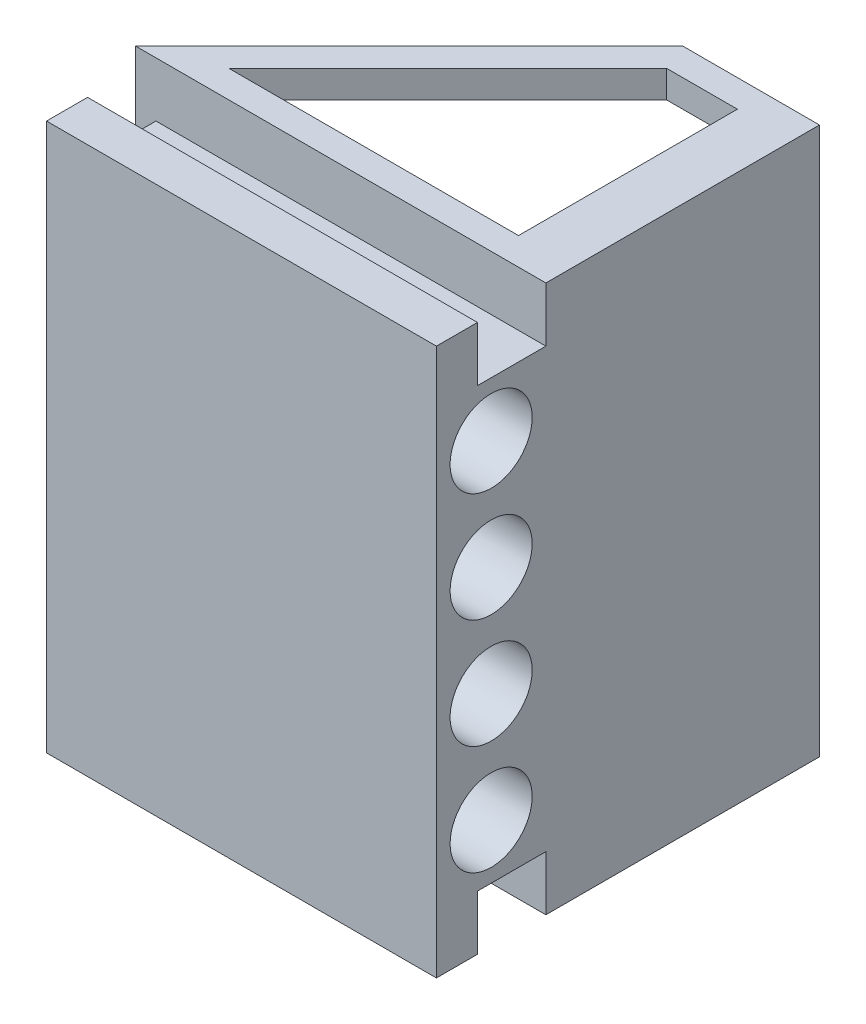
ISO-10303-21;
HEADER;
FILE_DESCRIPTION(('STEP AP214'),'2;1');
FILE_NAME('part.step','',(''),(''),'','','');
FILE_SCHEMA(('AUTOMOTIVE_DESIGN { 1 0 10303 214 1 1 1 1 }'));
ENDSEC;
DATA;
#1=APPLICATION_CONTEXT('core data for automotive mechanical design processes');
#2=APPLICATION_PROTOCOL_DEFINITION('international standard','automotive_design',2000,#1);
#3=PRODUCT_CONTEXT('',#1,'mechanical');
#4=PRODUCT('Part','Part','',(#3));
#5=PRODUCT_RELATED_PRODUCT_CATEGORY('part','',(#4));
#6=PRODUCT_DEFINITION_FORMATION('','',#4);
#7=PRODUCT_DEFINITION_CONTEXT('part definition',#1,'design');
#8=PRODUCT_DEFINITION('design','',#6,#7);
#9=PRODUCT_DEFINITION_SHAPE('','',#8);
#10=(LENGTH_UNIT() NAMED_UNIT(*) SI_UNIT(.MILLI.,.METRE.));
#11=(NAMED_UNIT(*) PLANE_ANGLE_UNIT() SI_UNIT($,.RADIAN.));
#12=(NAMED_UNIT(*) SI_UNIT($,.STERADIAN.) SOLID_ANGLE_UNIT());
#13=UNCERTAINTY_MEASURE_WITH_UNIT(LENGTH_MEASURE(1.E-05),#10,'distance_accuracy_value','');
#14=(GEOMETRIC_REPRESENTATION_CONTEXT(3) GLOBAL_UNCERTAINTY_ASSIGNED_CONTEXT((#13)) GLOBAL_UNIT_ASSIGNED_CONTEXT((#10,
#11,#12)) REPRESENTATION_CONTEXT('',''));
#15=CARTESIAN_POINT('',(0.,0.,0.));
#16=DIRECTION('',(0.,0.,1.));
#17=DIRECTION('',(1.,0.,0.));
#18=AXIS2_PLACEMENT_3D('',#15,#16,#17);
#19=CARTESIAN_POINT('',(-15.6947956584527,-80.,-16.3127275016129));
#20=DIRECTION('',(0.,0.,-1.));
#21=DIRECTION('',(-1.,0.,0.));
#22=AXIS2_PLACEMENT_3D('',#19,#20,#21);
#23=PLANE('',#22);
#24=DIRECTION('',(0.,1.,0.));
#25=VECTOR('',#24,1.);
#26=CARTESIAN_POINT('',(-15.6947956584527,-80.,-16.3127275016129));
#27=LINE('',#26,#25);
#28=CARTESIAN_POINT('',(-15.6947956584527,-4.,-16.3127275016129));
#29=VERTEX_POINT('',#28);
#30=CARTESIAN_POINT('',(-15.6947956584527,0.,-16.3127275016129));
#31=VERTEX_POINT('',#30);
#32=EDGE_CURVE('E278',#29,#31,#27,.T.);
#33=ORIENTED_EDGE('',*,*,#32,.F.);
#34=DIRECTION('',(1.,0.,0.));
#35=VECTOR('',#34,1.);
#36=CARTESIAN_POINT('',(-15.6947956584527,-4.,-16.3127275016129));
#37=LINE('',#36,#35);
#38=CARTESIAN_POINT('',(-5.35164990794508,-4.,-16.3127275016129));
#39=VERTEX_POINT('',#38);
#40=EDGE_CURVE('E196',#29,#39,#37,.T.);
#41=ORIENTED_EDGE('',*,*,#40,.T.);
#42=DIRECTION('',(0.,1.,0.));
#43=VECTOR('',#42,1.);
#44=CARTESIAN_POINT('',(-5.35164990794507,-80.,-16.3127275016129));
#45=LINE('',#44,#43);
#46=CARTESIAN_POINT('',(-5.35164990794507,0.,-16.3127275016129));
#47=VERTEX_POINT('',#46);
#48=EDGE_CURVE('E293',#39,#47,#45,.T.);
#49=ORIENTED_EDGE('',*,*,#48,.T.);
#50=DIRECTION('',(-1.,0.,0.));
#51=VECTOR('',#50,1.);
#52=CARTESIAN_POINT('',(-15.6947956584527,0.,-16.3127275016129));
#53=LINE('',#52,#51);
#54=EDGE_CURVE('E264',#47,#31,#53,.T.);
#55=ORIENTED_EDGE('',*,*,#54,.T.);
#56=EDGE_LOOP('',(#33,#41,#49,#55));
#57=FACE_BOUND('',#56,.T.);
#58=ADVANCED_FACE('F37',(#57),#23,.F.);
#59=CARTESIAN_POINT('',(-47.6947956584527,-80.,15.6872724983871));
#60=DIRECTION('',(-0.707106781186548,0.,-0.707106781186547));
#61=DIRECTION('',(-0.707106781186547,0.,0.707106781186548));
#62=AXIS2_PLACEMENT_3D('',#59,#60,#61);
#63=PLANE('',#62);
#64=DIRECTION('',(0.,1.,0.));
#65=VECTOR('',#64,1.);
#66=CARTESIAN_POINT('',(-47.6947956584527,-80.,15.6872724983871));
#67=LINE('',#66,#65);
#68=CARTESIAN_POINT('',(-47.6947956584527,-4.,15.6872724983871));
#69=VERTEX_POINT('',#68);
#70=CARTESIAN_POINT('',(-47.6947956584527,0.,15.6872724983871));
#71=VERTEX_POINT('',#70);
#72=EDGE_CURVE('E297',#69,#71,#67,.T.);
#73=ORIENTED_EDGE('',*,*,#72,.F.);
#74=DIRECTION('',(0.707106781186547,0.,-0.707106781186548));
#75=VECTOR('',#74,1.);
#76=CARTESIAN_POINT('',(-47.6947956584527,-4.,15.6872724983871));
#77=LINE('',#76,#75);
#78=EDGE_CURVE('E11',#69,#29,#77,.T.);
#79=ORIENTED_EDGE('',*,*,#78,.T.);
#80=ORIENTED_EDGE('',*,*,#32,.T.);
#81=DIRECTION('',(-0.707106781186547,0.,0.707106781186548));
#82=VECTOR('',#81,1.);
#83=CARTESIAN_POINT('',(-47.6947956584527,0.,15.6872724983871));
#84=LINE('',#83,#82);
#85=EDGE_CURVE('E281',#31,#71,#84,.T.);
#86=ORIENTED_EDGE('',*,*,#85,.T.);
#87=EDGE_LOOP('',(#73,#79,#80,#86));
#88=FACE_BOUND('',#87,.T.);
#89=ADVANCED_FACE('F412',(#88),#63,.F.);
#90=CARTESIAN_POINT('',(-54.3516499079451,-7.99999999999999,19.687272498387));
#91=DIRECTION('',(0.,1.,0.));
#92=DIRECTION('',(0.,0.,1.));
#93=AXIS2_PLACEMENT_3D('',#90,#91,#92);
#94=PLANE('',#93);
#95=DIRECTION('',(0.,0.,1.));
#96=VECTOR('',#95,1.);
#97=CARTESIAN_POINT('',(-54.3516499079451,-7.99999999999999,19.687272498387));
#98=LINE('',#97,#96);
#99=CARTESIAN_POINT('',(-54.3516499079451,-7.99999999999999,19.687272498387));
#100=VERTEX_POINT('',#99);
#101=CARTESIAN_POINT('',(-54.3516499079451,-7.99999999999999,29.6872724983871));
#102=VERTEX_POINT('',#101);
#103=EDGE_CURVE('E328',#100,#102,#98,.T.);
#104=ORIENTED_EDGE('',*,*,#103,.T.);
#105=DIRECTION('',(-1.,0.,0.));
#106=VECTOR('',#105,1.);
#107=CARTESIAN_POINT('',(-54.3516499079451,-7.99999999999999,29.6872724983871));
#108=LINE('',#107,#106);
#109=CARTESIAN_POINT('',(2.64835009205493,-7.99999999999999,29.6872724983871));
#110=VERTEX_POINT('',#109);
#111=EDGE_CURVE('E225',#110,#102,#108,.T.);
#112=ORIENTED_EDGE('',*,*,#111,.F.);
#113=DIRECTION('',(0.,0.,1.));
#114=VECTOR('',#113,1.);
#115=CARTESIAN_POINT('',(2.64835009205493,-7.99999999999999,19.687272498387));
#116=LINE('',#115,#114);
#117=CARTESIAN_POINT('',(2.64835009205493,-7.99999999999999,19.687272498387));
#118=VERTEX_POINT('',#117);
#119=EDGE_CURVE('E304',#118,#110,#116,.T.);
#120=ORIENTED_EDGE('',*,*,#119,.F.);
#121=DIRECTION('',(1.,0.,0.));
#122=VECTOR('',#121,1.);
#123=CARTESIAN_POINT('',(-54.3516499079451,-7.99999999999999,19.687272498387));
#124=LINE('',#123,#122);
#125=EDGE_CURVE('E335',#100,#118,#124,.T.);
#126=ORIENTED_EDGE('',*,*,#125,.F.);
#127=EDGE_LOOP('',(#104,#112,#120,#126));
#128=FACE_BOUND('',#127,.T.);
#129=ADVANCED_FACE('F425',(#128),#94,.T.);
#130=CARTESIAN_POINT('',(-54.3516499079451,-72.,19.687272498387));
#131=DIRECTION('',(0.,-1.,0.));
#132=DIRECTION('',(0.,0.,-1.));
#133=AXIS2_PLACEMENT_3D('',#130,#131,#132);
#134=PLANE('',#133);
#135=DIRECTION('',(0.,0.,-1.));
#136=VECTOR('',#135,1.);
#137=CARTESIAN_POINT('',(2.64835009205493,-72.,19.687272498387));
#138=LINE('',#137,#136);
#139=CARTESIAN_POINT('',(2.64835009205493,-72.,29.687272498387));
#140=VERTEX_POINT('',#139);
#141=CARTESIAN_POINT('',(2.64835009205493,-72.,19.687272498387));
#142=VERTEX_POINT('',#141);
#143=EDGE_CURVE('E329',#140,#142,#138,.T.);
#144=ORIENTED_EDGE('',*,*,#143,.F.);
#145=DIRECTION('',(1.,0.,0.));
#146=VECTOR('',#145,1.);
#147=CARTESIAN_POINT('',(-54.3516499079451,-72.,29.687272498387));
#148=LINE('',#147,#146);
#149=CARTESIAN_POINT('',(-54.3516499079451,-72.,29.687272498387));
#150=VERTEX_POINT('',#149);
#151=EDGE_CURVE('E244',#150,#140,#148,.T.);
#152=ORIENTED_EDGE('',*,*,#151,.F.);
#153=DIRECTION('',(0.,0.,-1.));
#154=VECTOR('',#153,1.);
#155=CARTESIAN_POINT('',(-54.3516499079451,-72.,19.687272498387));
#156=LINE('',#155,#154);
#157=CARTESIAN_POINT('',(-54.3516499079451,-72.,19.687272498387));
#158=VERTEX_POINT('',#157);
#159=EDGE_CURVE('E333',#150,#158,#156,.T.);
#160=ORIENTED_EDGE('',*,*,#159,.T.);
#161=DIRECTION('',(1.,0.,0.));
#162=VECTOR('',#161,1.);
#163=CARTESIAN_POINT('',(-54.3516499079451,-72.,19.687272498387));
#164=LINE('',#163,#162);
#165=EDGE_CURVE('E341',#158,#142,#164,.T.);
#166=ORIENTED_EDGE('',*,*,#165,.T.);
#167=EDGE_LOOP('',(#144,#152,#160,#166));
#168=FACE_BOUND('',#167,.T.);
#169=ADVANCED_FACE('F472',(#168),#134,.T.);
#170=CARTESIAN_POINT('',(-18.832188704779,-80.,-18.832188704779));
#171=DIRECTION('',(-0.707106781186548,0.,-0.707106781186548));
#172=DIRECTION('',(-0.707106781186548,0.,0.707106781186548));
#173=AXIS2_PLACEMENT_3D('',#170,#171,#172);
#174=PLANE('',#173);
#175=DIRECTION('',(0.707106781186548,0.,-0.707106781186548));
#176=VECTOR('',#175,1.);
#177=CARTESIAN_POINT('',(-18.832188704779,-4.,-18.832188704779));
#178=LINE('',#177,#176);
#179=CARTESIAN_POINT('',(-53.3516499079451,-4.,15.687272498387));
#180=VERTEX_POINT('',#179);
#181=CARTESIAN_POINT('',(-17.3516499079451,-4.,-20.312727501613));
#182=VERTEX_POINT('',#181);
#183=EDGE_CURVE('E208',#180,#182,#178,.T.);
#184=ORIENTED_EDGE('',*,*,#183,.F.);
#185=DIRECTION('',(0.,1.,0.));
#186=VECTOR('',#185,1.);
#187=CARTESIAN_POINT('',(-53.3516499079451,-4.,15.687272498387));
#188=LINE('',#187,#186);
#189=CARTESIAN_POINT('',(-53.3516499079451,-76.,15.687272498387));
#190=VERTEX_POINT('',#189);
#191=EDGE_CURVE('E201',#190,#180,#188,.T.);
#192=ORIENTED_EDGE('',*,*,#191,.F.);
#193=DIRECTION('',(-0.707106781186548,0.,0.707106781186548));
#194=VECTOR('',#193,1.);
#195=CARTESIAN_POINT('',(-18.832188704779,-76.,-18.832188704779));
#196=LINE('',#195,#194);
#197=CARTESIAN_POINT('',(-17.3516499079451,-76.,-20.312727501613));
#198=VERTEX_POINT('',#197);
#199=EDGE_CURVE('E186',#198,#190,#196,.T.);
#200=ORIENTED_EDGE('',*,*,#199,.F.);
#201=DIRECTION('',(0.,1.,0.));
#202=VECTOR('',#201,1.);
#203=CARTESIAN_POINT('',(-17.3516499079451,-80.,-20.3127275016129));
#204=LINE('',#203,#202);
#205=CARTESIAN_POINT('',(-17.3516499079451,-80.,-20.3127275016129));
#206=VERTEX_POINT('',#205);
#207=EDGE_CURVE('E368',#206,#198,#204,.T.);
#208=ORIENTED_EDGE('',*,*,#207,.F.);
#209=DIRECTION('',(-0.707106781186548,0.,0.707106781186548));
#210=VECTOR('',#209,1.);
#211=CARTESIAN_POINT('',(-18.832188704779,-80.,-18.832188704779));
#212=LINE('',#211,#210);
#213=CARTESIAN_POINT('',(-57.3516499079451,-80.,19.687272498387));
#214=VERTEX_POINT('',#213);
#215=EDGE_CURVE('E347',#206,#214,#212,.T.);
#216=ORIENTED_EDGE('',*,*,#215,.T.);
#217=DIRECTION('',(0.,1.,0.));
#218=VECTOR('',#217,1.);
#219=CARTESIAN_POINT('',(-57.3516499079451,-80.,19.687272498387));
#220=LINE('',#219,#218);
#221=CARTESIAN_POINT('',(-57.3516499079451,0.,19.687272498387));
#222=VERTEX_POINT('',#221);
#223=EDGE_CURVE('E358',#214,#222,#220,.T.);
#224=ORIENTED_EDGE('',*,*,#223,.T.);
#225=DIRECTION('',(-0.707106781186548,0.,0.707106781186548));
#226=VECTOR('',#225,1.);
#227=CARTESIAN_POINT('',(-18.832188704779,0.,-18.832188704779));
#228=LINE('',#227,#226);
#229=CARTESIAN_POINT('',(-17.3516499079451,0.,-20.3127275016129));
#230=VERTEX_POINT('',#229);
#231=EDGE_CURVE('E344',#230,#222,#228,.T.);
#232=ORIENTED_EDGE('',*,*,#231,.F.);
#233=EDGE_CURVE('E370',#182,#230,#204,.T.);
#234=ORIENTED_EDGE('',*,*,#233,.F.);
#235=EDGE_LOOP('',(#184,#192,#200,#208,#216,#224,#232,#234));
#236=FACE_BOUND('',#235,.T.);
#237=ADVANCED_FACE('F39',(#236),#174,.T.);
#238=CARTESIAN_POINT('',(0.,-80.,-20.312727501613));
#239=DIRECTION('',(0.,0.,1.));
#240=DIRECTION('',(1.,0.,0.));
#241=AXIS2_PLACEMENT_3D('',#238,#239,#240);
#242=PLANE('',#241);
#243=DIRECTION('',(0.,-1.,0.));
#244=VECTOR('',#243,1.);
#245=CARTESIAN_POINT('',(-5.35164990794508,-4.,-20.312727501613));
#246=LINE('',#245,#244);
#247=CARTESIAN_POINT('',(-5.35164990794508,-4.,-20.312727501613));
#248=VERTEX_POINT('',#247);
#249=CARTESIAN_POINT('',(-5.35164990794509,-76.,-20.312727501613));
#250=VERTEX_POINT('',#249);
#251=EDGE_CURVE('E52',#248,#250,#246,.T.);
#252=ORIENTED_EDGE('',*,*,#251,.F.);
#253=DIRECTION('',(1.,0.,0.));
#254=VECTOR('',#253,1.);
#255=CARTESIAN_POINT('',(-5.35164990794508,-4.,-20.312727501613));
#256=LINE('',#255,#254);
#257=EDGE_CURVE('E204',#182,#248,#256,.T.);
#258=ORIENTED_EDGE('',*,*,#257,.F.);
#259=ORIENTED_EDGE('',*,*,#233,.T.);
#260=DIRECTION('',(1.,0.,0.));
#261=VECTOR('',#260,1.);
#262=CARTESIAN_POINT('',(0.,0.,-20.312727501613));
#263=LINE('',#262,#261);
#264=CARTESIAN_POINT('',(2.64835009205492,0.,-20.312727501613));
#265=VERTEX_POINT('',#264);
#266=EDGE_CURVE('E351',#230,#265,#263,.T.);
#267=ORIENTED_EDGE('',*,*,#266,.T.);
#268=DIRECTION('',(0.,1.,0.));
#269=VECTOR('',#268,1.);
#270=CARTESIAN_POINT('',(2.64835009205492,-80.,-20.312727501613));
#271=LINE('',#270,#269);
#272=CARTESIAN_POINT('',(2.64835009205492,-80.,-20.312727501613));
#273=VERTEX_POINT('',#272);
#274=EDGE_CURVE('E371',#273,#265,#271,.T.);
#275=ORIENTED_EDGE('',*,*,#274,.F.);
#276=DIRECTION('',(1.,0.,0.));
#277=VECTOR('',#276,1.);
#278=CARTESIAN_POINT('',(0.,-80.,-20.312727501613));
#279=LINE('',#278,#277);
#280=EDGE_CURVE('E356',#206,#273,#279,.T.);
#281=ORIENTED_EDGE('',*,*,#280,.F.);
#282=ORIENTED_EDGE('',*,*,#207,.T.);
#283=DIRECTION('',(-1.,0.,0.));
#284=VECTOR('',#283,1.);
#285=CARTESIAN_POINT('',(-5.35164990794509,-76.,-20.312727501613));
#286=LINE('',#285,#284);
#287=EDGE_CURVE('E192',#250,#198,#286,.T.);
#288=ORIENTED_EDGE('',*,*,#287,.F.);
#289=EDGE_LOOP('',(#252,#258,#259,#267,#275,#281,#282,#288));
#290=FACE_BOUND('',#289,.T.);
#291=ADVANCED_FACE('F387',(#290),#242,.F.);
#292=CARTESIAN_POINT('',(2.64835009205493,-80.,0.));
#293=DIRECTION('',(-1.,0.,0.));
#294=DIRECTION('',(0.,0.,1.));
#295=AXIS2_PLACEMENT_3D('',#292,#293,#294);
#296=PLANE('',#295);
#297=CARTESIAN_POINT('',(2.64835009205493,-16.,27.6872724983871));
#298=DIRECTION('',(1.,0.,0.));
#299=DIRECTION('',(0.,0.,-1.));
#300=AXIS2_PLACEMENT_3D('',#297,#298,#299);
#301=CIRCLE('',#300,6.);
#302=CARTESIAN_POINT('',(2.64835009205493,-16.,21.6872724983871));
#303=VERTEX_POINT('',#302);
#304=EDGE_CURVE('E305',#303,#303,#301,.T.);
#305=ORIENTED_EDGE('',*,*,#304,.F.);
#306=EDGE_LOOP('',(#305));
#307=FACE_BOUND('',#306,.T.);
#308=CARTESIAN_POINT('',(2.64835009205493,-48.,27.6872724983871));
#309=DIRECTION('',(1.,0.,0.));
#310=DIRECTION('',(0.,0.,-1.));
#311=AXIS2_PLACEMENT_3D('',#308,#309,#310);
#312=CIRCLE('',#311,6.);
#313=CARTESIAN_POINT('',(2.64835009205493,-48.,21.6872724983871));
#314=VERTEX_POINT('',#313);
#315=EDGE_CURVE('E292',#314,#314,#312,.T.);
#316=ORIENTED_EDGE('',*,*,#315,.F.);
#317=EDGE_LOOP('',(#316));
#318=FACE_BOUND('',#317,.T.);
#319=CARTESIAN_POINT('',(2.64835009205493,-64.,27.6872724983871));
#320=DIRECTION('',(1.,0.,0.));
#321=DIRECTION('',(0.,0.,1.));
#322=AXIS2_PLACEMENT_3D('',#319,#320,#321);
#323=CIRCLE('',#322,6.);
#324=CARTESIAN_POINT('',(2.64835009205493,-64.,33.6872724983871));
#325=VERTEX_POINT('',#324);
#326=EDGE_CURVE('E312',#325,#325,#323,.T.);
#327=ORIENTED_EDGE('',*,*,#326,.F.);
#328=EDGE_LOOP('',(#327));
#329=FACE_BOUND('',#328,.T.);
#330=CARTESIAN_POINT('',(2.64835009205493,-32.,27.6872724983871));
#331=DIRECTION('',(1.,0.,0.));
#332=DIRECTION('',(0.,0.,1.));
#333=AXIS2_PLACEMENT_3D('',#330,#331,#332);
#334=CIRCLE('',#333,6.);
#335=CARTESIAN_POINT('',(2.64835009205493,-32.,33.6872724983871));
#336=VERTEX_POINT('',#335);
#337=EDGE_CURVE('E317',#336,#336,#334,.T.);
#338=ORIENTED_EDGE('',*,*,#337,.F.);
#339=EDGE_LOOP('',(#338));
#340=FACE_BOUND('',#339,.T.);
#341=DIRECTION('',(0.,0.,1.));
#342=VECTOR('',#341,1.);
#343=CARTESIAN_POINT('',(2.64835009205493,0.,0.));
#344=LINE('',#343,#342);
#345=CARTESIAN_POINT('',(2.64835009205493,0.,19.687272498387));
#346=VERTEX_POINT('',#345);
#347=EDGE_CURVE('E364',#265,#346,#344,.T.);
#348=ORIENTED_EDGE('',*,*,#347,.T.);
#349=DIRECTION('',(0.,1.,0.));
#350=VECTOR('',#349,1.);
#351=CARTESIAN_POINT('',(2.64835009205493,-80.,19.687272498387));
#352=LINE('',#351,#350);
#353=EDGE_CURVE('E377',#118,#346,#352,.T.);
#354=ORIENTED_EDGE('',*,*,#353,.F.);
#355=ORIENTED_EDGE('',*,*,#119,.T.);
#356=DIRECTION('',(0.,-1.,0.));
#357=VECTOR('',#356,1.);
#358=CARTESIAN_POINT('',(2.64835009205493,0.,29.6872724983871));
#359=LINE('',#358,#357);
#360=CARTESIAN_POINT('',(2.64835009205493,0.,29.6872724983871));
#361=VERTEX_POINT('',#360);
#362=EDGE_CURVE('E241',#361,#110,#359,.T.);
#363=ORIENTED_EDGE('',*,*,#362,.F.);
#364=DIRECTION('',(0.,0.,-1.));
#365=VECTOR('',#364,1.);
#366=CARTESIAN_POINT('',(2.64835009205493,0.,35.6872724983871));
#367=LINE('',#366,#365);
#368=CARTESIAN_POINT('',(2.64835009205493,0.,35.6872724983871));
#369=VERTEX_POINT('',#368);
#370=EDGE_CURVE('E232',#369,#361,#367,.T.);
#371=ORIENTED_EDGE('',*,*,#370,.F.);
#372=DIRECTION('',(0.,-1.,0.));
#373=VECTOR('',#372,1.);
#374=CARTESIAN_POINT('',(2.64835009205493,-7.99999999999999,35.6872724983871));
#375=LINE('',#374,#373);
#376=CARTESIAN_POINT('',(2.64835009205493,-80.,35.687272498387));
#377=VERTEX_POINT('',#376);
#378=EDGE_CURVE('E338',#369,#377,#375,.T.);
#379=ORIENTED_EDGE('',*,*,#378,.T.);
#380=DIRECTION('',(0.,0.,1.));
#381=VECTOR('',#380,1.);
#382=CARTESIAN_POINT('',(2.64835009205493,-80.,35.687272498387));
#383=LINE('',#382,#381);
#384=CARTESIAN_POINT('',(2.64835009205493,-80.,29.687272498387));
#385=VERTEX_POINT('',#384);
#386=EDGE_CURVE('E250',#385,#377,#383,.T.);
#387=ORIENTED_EDGE('',*,*,#386,.F.);
#388=DIRECTION('',(0.,1.,0.));
#389=VECTOR('',#388,1.);
#390=CARTESIAN_POINT('',(2.64835009205493,-80.,29.687272498387));
#391=LINE('',#390,#389);
#392=EDGE_CURVE('E256',#385,#140,#391,.T.);
#393=ORIENTED_EDGE('',*,*,#392,.T.);
#394=ORIENTED_EDGE('',*,*,#143,.T.);
#395=CARTESIAN_POINT('',(2.64835009205493,-80.,19.687272498387));
#396=VERTEX_POINT('',#395);
#397=EDGE_CURVE('E374',#396,#142,#352,.T.);
#398=ORIENTED_EDGE('',*,*,#397,.F.);
#399=DIRECTION('',(0.,0.,1.));
#400=VECTOR('',#399,1.);
#401=CARTESIAN_POINT('',(2.64835009205493,-80.,0.));
#402=LINE('',#401,#400);
#403=EDGE_CURVE('E354',#273,#396,#402,.T.);
#404=ORIENTED_EDGE('',*,*,#403,.F.);
#405=ORIENTED_EDGE('',*,*,#274,.T.);
#406=EDGE_LOOP('',(#348,#354,#355,#363,#371,#379,#387,#393,#394,#398,#404,#405));
#407=FACE_BOUND('',#406,.T.);
#408=ADVANCED_FACE('F489',(#307,#318,#329,#340,#407),#296,.F.);
#409=CARTESIAN_POINT('',(0.,-80.,19.687272498387));
#410=DIRECTION('',(0.,0.,1.));
#411=DIRECTION('',(1.,0.,0.));
#412=AXIS2_PLACEMENT_3D('',#409,#410,#411);
#413=PLANE('',#412);
#414=ORIENTED_EDGE('',*,*,#165,.F.);
#415=DIRECTION('',(0.,1.,0.));
#416=VECTOR('',#415,1.);
#417=CARTESIAN_POINT('',(-54.3516499079451,-7.99999999999999,19.687272498387));
#418=LINE('',#417,#416);
#419=EDGE_CURVE('E325',#158,#100,#418,.T.);
#420=ORIENTED_EDGE('',*,*,#419,.T.);
#421=ORIENTED_EDGE('',*,*,#125,.T.);
#422=ORIENTED_EDGE('',*,*,#353,.T.);
#423=DIRECTION('',(1.,0.,0.));
#424=VECTOR('',#423,1.);
#425=CARTESIAN_POINT('',(0.,0.,19.687272498387));
#426=LINE('',#425,#424);
#427=EDGE_CURVE('E361',#222,#346,#426,.T.);
#428=ORIENTED_EDGE('',*,*,#427,.F.);
#429=ORIENTED_EDGE('',*,*,#223,.F.);
#430=DIRECTION('',(1.,0.,0.));
#431=VECTOR('',#430,1.);
#432=CARTESIAN_POINT('',(0.,-80.,19.687272498387));
#433=LINE('',#432,#431);
#434=EDGE_CURVE('E350',#214,#396,#433,.T.);
#435=ORIENTED_EDGE('',*,*,#434,.T.);
#436=ORIENTED_EDGE('',*,*,#397,.T.);
#437=EDGE_LOOP('',(#414,#420,#421,#422,#428,#429,#435,#436));
#438=FACE_BOUND('',#437,.T.);
#439=ADVANCED_FACE('F401',(#438),#413,.T.);
#440=CARTESIAN_POINT('',(0.,-80.,0.));
#441=DIRECTION('',(0.,1.,0.));
#442=DIRECTION('',(0.,0.,1.));
#443=AXIS2_PLACEMENT_3D('',#440,#441,#442);
#444=PLANE('',#443);
#445=DIRECTION('',(0.,0.,-1.));
#446=VECTOR('',#445,1.);
#447=CARTESIAN_POINT('',(-5.35164990794507,-80.,-16.3127275016129));
#448=LINE('',#447,#446);
#449=CARTESIAN_POINT('',(-5.35164990794507,-80.,15.687272498387));
#450=VERTEX_POINT('',#449);
#451=CARTESIAN_POINT('',(-5.35164990794507,-80.,-16.3127275016129));
#452=VERTEX_POINT('',#451);
#453=EDGE_CURVE('E275',#450,#452,#448,.T.);
#454=ORIENTED_EDGE('',*,*,#453,.T.);
#455=DIRECTION('',(-1.,0.,0.));
#456=VECTOR('',#455,1.);
#457=CARTESIAN_POINT('',(-15.6947956584527,-80.,-16.3127275016129));
#458=LINE('',#457,#456);
#459=CARTESIAN_POINT('',(-15.6947956584527,-80.,-16.3127275016129));
#460=VERTEX_POINT('',#459);
#461=EDGE_CURVE('E265',#452,#460,#458,.T.);
#462=ORIENTED_EDGE('',*,*,#461,.T.);
#463=DIRECTION('',(-0.707106781186547,0.,0.707106781186548));
#464=VECTOR('',#463,1.);
#465=CARTESIAN_POINT('',(-47.6947956584527,-80.,15.6872724983871));
#466=LINE('',#465,#464);
#467=CARTESIAN_POINT('',(-47.6947956584527,-80.,15.6872724983871));
#468=VERTEX_POINT('',#467);
#469=EDGE_CURVE('E268',#460,#468,#466,.T.);
#470=ORIENTED_EDGE('',*,*,#469,.T.);
#471=DIRECTION('',(1.,0.,0.));
#472=VECTOR('',#471,1.);
#473=CARTESIAN_POINT('',(-5.35164990794507,-80.,15.687272498387));
#474=LINE('',#473,#472);
#475=EDGE_CURVE('E272',#468,#450,#474,.T.);
#476=ORIENTED_EDGE('',*,*,#475,.T.);
#477=EDGE_LOOP('',(#454,#462,#470,#476));
#478=FACE_BOUND('',#477,.T.);
#479=ORIENTED_EDGE('',*,*,#215,.F.);
#480=ORIENTED_EDGE('',*,*,#280,.T.);
#481=ORIENTED_EDGE('',*,*,#403,.T.);
#482=ORIENTED_EDGE('',*,*,#434,.F.);
#483=EDGE_LOOP('',(#479,#480,#481,#482));
#484=FACE_BOUND('',#483,.T.);
#485=ADVANCED_FACE('F396',(#478,#484),#444,.F.);
#486=CARTESIAN_POINT('',(0.,0.,0.));
#487=DIRECTION('',(0.,1.,0.));
#488=DIRECTION('',(0.,0.,1.));
#489=AXIS2_PLACEMENT_3D('',#486,#487,#488);
#490=PLANE('',#489);
#491=ORIENTED_EDGE('',*,*,#54,.F.);
#492=DIRECTION('',(0.,0.,-1.));
#493=VECTOR('',#492,1.);
#494=CARTESIAN_POINT('',(-5.35164990794507,0.,-16.3127275016129));
#495=LINE('',#494,#493);
#496=CARTESIAN_POINT('',(-5.35164990794507,0.,15.687272498387));
#497=VERTEX_POINT('',#496);
#498=EDGE_CURVE('E269',#497,#47,#495,.T.);
#499=ORIENTED_EDGE('',*,*,#498,.F.);
#500=DIRECTION('',(1.,0.,0.));
#501=VECTOR('',#500,1.);
#502=CARTESIAN_POINT('',(-5.35164990794507,0.,15.687272498387));
#503=LINE('',#502,#501);
#504=EDGE_CURVE('E284',#71,#497,#503,.T.);
#505=ORIENTED_EDGE('',*,*,#504,.F.);
#506=ORIENTED_EDGE('',*,*,#85,.F.);
#507=EDGE_LOOP('',(#491,#499,#505,#506));
#508=FACE_BOUND('',#507,.T.);
#509=ORIENTED_EDGE('',*,*,#231,.T.);
#510=ORIENTED_EDGE('',*,*,#427,.T.);
#511=ORIENTED_EDGE('',*,*,#347,.F.);
#512=ORIENTED_EDGE('',*,*,#266,.F.);
#513=EDGE_LOOP('',(#509,#510,#511,#512));
#514=FACE_BOUND('',#513,.T.);
#515=ADVANCED_FACE('F406',(#508,#514),#490,.T.);
#516=CARTESIAN_POINT('',(-54.3516499079451,-7.99999999999999,35.6872724983871));
#517=DIRECTION('',(0.,0.,1.));
#518=DIRECTION('',(0.,-1.,0.));
#519=AXIS2_PLACEMENT_3D('',#516,#517,#518);
#520=PLANE('',#519);
#521=ORIENTED_EDGE('',*,*,#378,.F.);
#522=DIRECTION('',(1.,0.,0.));
#523=VECTOR('',#522,1.);
#524=CARTESIAN_POINT('',(-54.3516499079451,0.,35.6872724983871));
#525=LINE('',#524,#523);
#526=CARTESIAN_POINT('',(-54.3516499079451,0.,35.6872724983871));
#527=VERTEX_POINT('',#526);
#528=EDGE_CURVE('E229',#527,#369,#525,.T.);
#529=ORIENTED_EDGE('',*,*,#528,.F.);
#530=DIRECTION('',(0.,-1.,0.));
#531=VECTOR('',#530,1.);
#532=CARTESIAN_POINT('',(-54.3516499079451,-7.99999999999999,35.6872724983871));
#533=LINE('',#532,#531);
#534=CARTESIAN_POINT('',(-54.3516499079451,-80.,35.687272498387));
#535=VERTEX_POINT('',#534);
#536=EDGE_CURVE('E331',#527,#535,#533,.T.);
#537=ORIENTED_EDGE('',*,*,#536,.T.);
#538=DIRECTION('',(-1.,0.,0.));
#539=VECTOR('',#538,1.);
#540=CARTESIAN_POINT('',(-54.3516499079451,-80.,35.687272498387));
#541=LINE('',#540,#539);
#542=EDGE_CURVE('E253',#377,#535,#541,.T.);
#543=ORIENTED_EDGE('',*,*,#542,.F.);
#544=EDGE_LOOP('',(#521,#529,#537,#543));
#545=FACE_BOUND('',#544,.T.);
#546=ADVANCED_FACE('F470',(#545),#520,.T.);
#547=CARTESIAN_POINT('',(-54.3516499079451,0.,0.));
#548=DIRECTION('',(-1.,0.,0.));
#549=DIRECTION('',(0.,0.,1.));
#550=AXIS2_PLACEMENT_3D('',#547,#548,#549);
#551=PLANE('',#550);
#552=ORIENTED_EDGE('',*,*,#419,.F.);
#553=ORIENTED_EDGE('',*,*,#159,.F.);
#554=DIRECTION('',(0.,1.,0.));
#555=VECTOR('',#554,1.);
#556=CARTESIAN_POINT('',(-54.3516499079451,-80.,29.687272498387));
#557=LINE('',#556,#555);
#558=CARTESIAN_POINT('',(-54.3516499079451,-80.,29.687272498387));
#559=VERTEX_POINT('',#558);
#560=EDGE_CURVE('E261',#559,#150,#557,.T.);
#561=ORIENTED_EDGE('',*,*,#560,.F.);
#562=DIRECTION('',(0.,0.,-1.));
#563=VECTOR('',#562,1.);
#564=CARTESIAN_POINT('',(-54.3516499079451,-80.,35.687272498387));
#565=LINE('',#564,#563);
#566=EDGE_CURVE('E245',#535,#559,#565,.T.);
#567=ORIENTED_EDGE('',*,*,#566,.F.);
#568=ORIENTED_EDGE('',*,*,#536,.F.);
#569=DIRECTION('',(0.,0.,1.));
#570=VECTOR('',#569,1.);
#571=CARTESIAN_POINT('',(-54.3516499079451,0.,35.6872724983871));
#572=LINE('',#571,#570);
#573=CARTESIAN_POINT('',(-54.3516499079451,0.,29.6872724983871));
#574=VERTEX_POINT('',#573);
#575=EDGE_CURVE('E226',#574,#527,#572,.T.);
#576=ORIENTED_EDGE('',*,*,#575,.F.);
#577=DIRECTION('',(0.,-1.,0.));
#578=VECTOR('',#577,1.);
#579=CARTESIAN_POINT('',(-54.3516499079451,0.,29.6872724983871));
#580=LINE('',#579,#578);
#581=EDGE_CURVE('E236',#574,#102,#580,.T.);
#582=ORIENTED_EDGE('',*,*,#581,.T.);
#583=ORIENTED_EDGE('',*,*,#103,.F.);
#584=EDGE_LOOP('',(#552,#553,#561,#567,#568,#576,#582,#583));
#585=FACE_BOUND('',#584,.T.);
#586=ADVANCED_FACE('F460',(#585),#551,.T.);
#587=CARTESIAN_POINT('',(-48.3516499079451,-32.,27.6872724983871));
#588=DIRECTION('',(1.,0.,0.));
#589=DIRECTION('',(0.,0.,-1.));
#590=AXIS2_PLACEMENT_3D('',#587,#588,#589);
#591=CYLINDRICAL_SURFACE('',#590,6.);
#592=CARTESIAN_POINT('',(-48.3516499079451,-32.,27.6872724983871));
#593=DIRECTION('',(1.,0.,0.));
#594=DIRECTION('',(0.,0.,1.));
#595=AXIS2_PLACEMENT_3D('',#592,#593,#594);
#596=CIRCLE('',#595,6.);
#597=CARTESIAN_POINT('',(-48.3516499079451,-32.,33.6872724983871));
#598=VERTEX_POINT('',#597);
#599=EDGE_CURVE('E308',#598,#598,#596,.T.);
#600=ORIENTED_EDGE('',*,*,#599,.F.);
#601=EDGE_LOOP('',(#600));
#602=FACE_BOUND('',#601,.T.);
#603=ORIENTED_EDGE('',*,*,#337,.T.);
#604=EDGE_LOOP('',(#603));
#605=FACE_BOUND('',#604,.T.);
#606=ADVANCED_FACE('F456',(#602,#605),#591,.F.);
#607=CARTESIAN_POINT('',(-48.3516499079451,-32.,27.6872724983871));
#608=DIRECTION('',(-1.,0.,0.));
#609=DIRECTION('',(0.,0.,1.));
#610=AXIS2_PLACEMENT_3D('',#607,#608,#609);
#611=PLANE('',#610);
#612=ORIENTED_EDGE('',*,*,#599,.T.);
#613=EDGE_LOOP('',(#612));
#614=FACE_BOUND('',#613,.T.);
#615=ADVANCED_FACE('F452',(#614),#611,.F.);
#616=CARTESIAN_POINT('',(-48.3516499079451,-64.,27.6872724983871));
#617=DIRECTION('',(1.,0.,0.));
#618=DIRECTION('',(0.,0.,-1.));
#619=AXIS2_PLACEMENT_3D('',#616,#617,#618);
#620=CYLINDRICAL_SURFACE('',#619,6.);
#621=CARTESIAN_POINT('',(-48.3516499079451,-64.,27.6872724983871));
#622=DIRECTION('',(1.,0.,0.));
#623=DIRECTION('',(0.,0.,1.));
#624=AXIS2_PLACEMENT_3D('',#621,#622,#623);
#625=CIRCLE('',#624,6.);
#626=CARTESIAN_POINT('',(-48.3516499079451,-64.,33.6872724983871));
#627=VERTEX_POINT('',#626);
#628=EDGE_CURVE('E320',#627,#627,#625,.T.);
#629=ORIENTED_EDGE('',*,*,#628,.F.);
#630=EDGE_LOOP('',(#629));
#631=FACE_BOUND('',#630,.T.);
#632=ORIENTED_EDGE('',*,*,#326,.T.);
#633=EDGE_LOOP('',(#632));
#634=FACE_BOUND('',#633,.T.);
#635=ADVANCED_FACE('F455',(#631,#634),#620,.F.);
#636=CARTESIAN_POINT('',(-48.3516499079451,-64.,27.6872724983871));
#637=DIRECTION('',(-1.,0.,0.));
#638=DIRECTION('',(0.,0.,1.));
#639=AXIS2_PLACEMENT_3D('',#636,#637,#638);
#640=PLANE('',#639);
#641=ORIENTED_EDGE('',*,*,#628,.T.);
#642=EDGE_LOOP('',(#641));
#643=FACE_BOUND('',#642,.T.);
#644=ADVANCED_FACE('F450',(#643),#640,.F.);
#645=CARTESIAN_POINT('',(-48.3516499079451,-48.,27.6872724983871));
#646=DIRECTION('',(1.,0.,0.));
#647=DIRECTION('',(0.,0.,-1.));
#648=AXIS2_PLACEMENT_3D('',#645,#646,#647);
#649=CYLINDRICAL_SURFACE('',#648,6.);
#650=CARTESIAN_POINT('',(-48.3516499079451,-48.,27.6872724983871));
#651=DIRECTION('',(1.,0.,0.));
#652=DIRECTION('',(0.,0.,-1.));
#653=AXIS2_PLACEMENT_3D('',#650,#651,#652);
#654=CIRCLE('',#653,6.);
#655=CARTESIAN_POINT('',(-48.3516499079451,-48.,21.6872724983871));
#656=VERTEX_POINT('',#655);
#657=EDGE_CURVE('E309',#656,#656,#654,.T.);
#658=ORIENTED_EDGE('',*,*,#657,.F.);
#659=EDGE_LOOP('',(#658));
#660=FACE_BOUND('',#659,.T.);
#661=ORIENTED_EDGE('',*,*,#315,.T.);
#662=EDGE_LOOP('',(#661));
#663=FACE_BOUND('',#662,.T.);
#664=ADVANCED_FACE('F446',(#660,#663),#649,.F.);
#665=CARTESIAN_POINT('',(-48.3516499079451,-48.,27.6872724983871));
#666=DIRECTION('',(1.,0.,0.));
#667=DIRECTION('',(0.,0.,-1.));
#668=AXIS2_PLACEMENT_3D('',#665,#666,#667);
#669=PLANE('',#668);
#670=ORIENTED_EDGE('',*,*,#657,.T.);
#671=EDGE_LOOP('',(#670));
#672=FACE_BOUND('',#671,.T.);
#673=ADVANCED_FACE('F440',(#672),#669,.T.);
#674=CARTESIAN_POINT('',(-48.3516499079451,-16.,27.6872724983871));
#675=DIRECTION('',(1.,0.,0.));
#676=DIRECTION('',(0.,0.,-1.));
#677=AXIS2_PLACEMENT_3D('',#674,#675,#676);
#678=CYLINDRICAL_SURFACE('',#677,6.);
#679=CARTESIAN_POINT('',(-48.3516499079451,-16.,27.6872724983871));
#680=DIRECTION('',(1.,0.,0.));
#681=DIRECTION('',(0.,0.,-1.));
#682=AXIS2_PLACEMENT_3D('',#679,#680,#681);
#683=CIRCLE('',#682,6.);
#684=CARTESIAN_POINT('',(-48.3516499079451,-16.,21.6872724983871));
#685=VERTEX_POINT('',#684);
#686=EDGE_CURVE('E301',#685,#685,#683,.T.);
#687=ORIENTED_EDGE('',*,*,#686,.F.);
#688=EDGE_LOOP('',(#687));
#689=FACE_BOUND('',#688,.T.);
#690=ORIENTED_EDGE('',*,*,#304,.T.);
#691=EDGE_LOOP('',(#690));
#692=FACE_BOUND('',#691,.T.);
#693=ADVANCED_FACE('F435',(#689,#692),#678,.F.);
#694=CARTESIAN_POINT('',(-48.3516499079451,-16.,27.6872724983871));
#695=DIRECTION('',(1.,0.,0.));
#696=DIRECTION('',(0.,0.,-1.));
#697=AXIS2_PLACEMENT_3D('',#694,#695,#696);
#698=PLANE('',#697);
#699=ORIENTED_EDGE('',*,*,#686,.T.);
#700=EDGE_LOOP('',(#699));
#701=FACE_BOUND('',#700,.T.);
#702=ADVANCED_FACE('F429',(#701),#698,.T.);
#703=CARTESIAN_POINT('',(-5.35164990794509,-76.,-16.3127275016129));
#704=VERTEX_POINT('',#703);
#705=EDGE_CURVE('E289',#452,#704,#45,.T.);
#706=ORIENTED_EDGE('',*,*,#705,.T.);
#707=DIRECTION('',(-1.,0.,0.));
#708=VECTOR('',#707,1.);
#709=CARTESIAN_POINT('',(-15.6947956584527,-76.,-16.3127275016129));
#710=LINE('',#709,#708);
#711=CARTESIAN_POINT('',(-15.6947956584527,-76.,-16.3127275016129));
#712=VERTEX_POINT('',#711);
#713=EDGE_CURVE('E197',#704,#712,#710,.T.);
#714=ORIENTED_EDGE('',*,*,#713,.T.);
#715=EDGE_CURVE('E298',#460,#712,#27,.T.);
#716=ORIENTED_EDGE('',*,*,#715,.F.);
#717=ORIENTED_EDGE('',*,*,#461,.F.);
#718=EDGE_LOOP('',(#706,#714,#716,#717));
#719=FACE_BOUND('',#718,.T.);
#720=ADVANCED_FACE('F382',(#719),#23,.F.);
#721=CARTESIAN_POINT('',(-5.35164990794507,-80.,-16.3127275016129));
#722=DIRECTION('',(1.,0.,0.));
#723=DIRECTION('',(0.,0.,-1.));
#724=AXIS2_PLACEMENT_3D('',#721,#722,#723);
#725=PLANE('',#724);
#726=DIRECTION('',(0.,1.,0.));
#727=VECTOR('',#726,1.);
#728=CARTESIAN_POINT('',(-5.35164990794507,-80.,15.687272498387));
#729=LINE('',#728,#727);
#730=EDGE_CURVE('E294',#450,#497,#729,.T.);
#731=ORIENTED_EDGE('',*,*,#730,.T.);
#732=ORIENTED_EDGE('',*,*,#498,.T.);
#733=ORIENTED_EDGE('',*,*,#48,.F.);
#734=DIRECTION('',(0.,0.,-1.));
#735=VECTOR('',#734,1.);
#736=CARTESIAN_POINT('',(-5.35164990794508,-4.,15.687272498387));
#737=LINE('',#736,#735);
#738=EDGE_CURVE('E217',#39,#248,#737,.T.);
#739=ORIENTED_EDGE('',*,*,#738,.T.);
#740=ORIENTED_EDGE('',*,*,#251,.T.);
#741=DIRECTION('',(0.,0.,-1.));
#742=VECTOR('',#741,1.);
#743=CARTESIAN_POINT('',(-5.35164990794509,-76.,15.687272498387));
#744=LINE('',#743,#742);
#745=EDGE_CURVE('E210',#704,#250,#744,.T.);
#746=ORIENTED_EDGE('',*,*,#745,.F.);
#747=ORIENTED_EDGE('',*,*,#705,.F.);
#748=ORIENTED_EDGE('',*,*,#453,.F.);
#749=EDGE_LOOP('',(#731,#732,#733,#739,#740,#746,#747,#748));
#750=FACE_BOUND('',#749,.T.);
#751=ADVANCED_FACE('F385',(#750),#725,.F.);
#752=CARTESIAN_POINT('',(-5.35164990794507,-80.,15.687272498387));
#753=DIRECTION('',(0.,0.,1.));
#754=DIRECTION('',(1.,0.,0.));
#755=AXIS2_PLACEMENT_3D('',#752,#753,#754);
#756=PLANE('',#755);
#757=CARTESIAN_POINT('',(-47.6947956584527,-76.,15.687272498387));
#758=VERTEX_POINT('',#757);
#759=EDGE_CURVE('E203',#468,#758,#67,.T.);
#760=ORIENTED_EDGE('',*,*,#759,.T.);
#761=DIRECTION('',(-1.,0.,0.));
#762=VECTOR('',#761,1.);
#763=CARTESIAN_POINT('',(-5.35164990794509,-76.,15.687272498387));
#764=LINE('',#763,#762);
#765=EDGE_CURVE('E189',#758,#190,#764,.T.);
#766=ORIENTED_EDGE('',*,*,#765,.T.);
#767=ORIENTED_EDGE('',*,*,#191,.T.);
#768=DIRECTION('',(1.,0.,0.));
#769=VECTOR('',#768,1.);
#770=CARTESIAN_POINT('',(-5.35164990794508,-4.,15.687272498387));
#771=LINE('',#770,#769);
#772=EDGE_CURVE('E60',#180,#69,#771,.T.);
#773=ORIENTED_EDGE('',*,*,#772,.T.);
#774=ORIENTED_EDGE('',*,*,#72,.T.);
#775=ORIENTED_EDGE('',*,*,#504,.T.);
#776=ORIENTED_EDGE('',*,*,#730,.F.);
#777=ORIENTED_EDGE('',*,*,#475,.F.);
#778=EDGE_LOOP('',(#760,#766,#767,#773,#774,#775,#776,#777));
#779=FACE_BOUND('',#778,.T.);
#780=ADVANCED_FACE('F200',(#779),#756,.F.);
#781=ORIENTED_EDGE('',*,*,#715,.T.);
#782=DIRECTION('',(-0.707106781186547,0.,0.707106781186548));
#783=VECTOR('',#782,1.);
#784=CARTESIAN_POINT('',(-47.6947956584527,-76.,15.6872724983871));
#785=LINE('',#784,#783);
#786=EDGE_CURVE('E45',#712,#758,#785,.T.);
#787=ORIENTED_EDGE('',*,*,#786,.T.);
#788=ORIENTED_EDGE('',*,*,#759,.F.);
#789=ORIENTED_EDGE('',*,*,#469,.F.);
#790=EDGE_LOOP('',(#781,#787,#788,#789));
#791=FACE_BOUND('',#790,.T.);
#792=ADVANCED_FACE('F379',(#791),#63,.F.);
#793=CARTESIAN_POINT('',(-54.3516499079451,-80.,29.687272498387));
#794=DIRECTION('',(0.,0.,1.));
#795=DIRECTION('',(1.,0.,0.));
#796=AXIS2_PLACEMENT_3D('',#793,#794,#795);
#797=PLANE('',#796);
#798=ORIENTED_EDGE('',*,*,#151,.T.);
#799=ORIENTED_EDGE('',*,*,#392,.F.);
#800=DIRECTION('',(1.,0.,0.));
#801=VECTOR('',#800,1.);
#802=CARTESIAN_POINT('',(-54.3516499079451,-80.,29.687272498387));
#803=LINE('',#802,#801);
#804=EDGE_CURVE('E248',#559,#385,#803,.T.);
#805=ORIENTED_EDGE('',*,*,#804,.F.);
#806=ORIENTED_EDGE('',*,*,#560,.T.);
#807=EDGE_LOOP('',(#798,#799,#805,#806));
#808=FACE_BOUND('',#807,.T.);
#809=ADVANCED_FACE('F580',(#808),#797,.F.);
#810=CARTESIAN_POINT('',(0.,-80.,0.));
#811=DIRECTION('',(0.,-1.,0.));
#812=DIRECTION('',(0.,0.,-1.));
#813=AXIS2_PLACEMENT_3D('',#810,#811,#812);
#814=PLANE('',#813);
#815=ORIENTED_EDGE('',*,*,#566,.T.);
#816=ORIENTED_EDGE('',*,*,#804,.T.);
#817=ORIENTED_EDGE('',*,*,#386,.T.);
#818=ORIENTED_EDGE('',*,*,#542,.T.);
#819=EDGE_LOOP('',(#815,#816,#817,#818));
#820=FACE_BOUND('',#819,.T.);
#821=ADVANCED_FACE('F620',(#820),#814,.T.);
#822=CARTESIAN_POINT('',(-54.3516499079451,0.,29.6872724983871));
#823=DIRECTION('',(0.,0.,1.));
#824=DIRECTION('',(1.,0.,0.));
#825=AXIS2_PLACEMENT_3D('',#822,#823,#824);
#826=PLANE('',#825);
#827=ORIENTED_EDGE('',*,*,#111,.T.);
#828=ORIENTED_EDGE('',*,*,#581,.F.);
#829=DIRECTION('',(-1.,0.,0.));
#830=VECTOR('',#829,1.);
#831=CARTESIAN_POINT('',(-54.3516499079451,0.,29.6872724983871));
#832=LINE('',#831,#830);
#833=EDGE_CURVE('E234',#361,#574,#832,.T.);
#834=ORIENTED_EDGE('',*,*,#833,.F.);
#835=ORIENTED_EDGE('',*,*,#362,.T.);
#836=EDGE_LOOP('',(#827,#828,#834,#835));
#837=FACE_BOUND('',#836,.T.);
#838=ADVANCED_FACE('F628',(#837),#826,.F.);
#839=CARTESIAN_POINT('',(0.,0.,0.));
#840=DIRECTION('',(0.,-1.,0.));
#841=DIRECTION('',(0.,0.,-1.));
#842=AXIS2_PLACEMENT_3D('',#839,#840,#841);
#843=PLANE('',#842);
#844=ORIENTED_EDGE('',*,*,#575,.T.);
#845=ORIENTED_EDGE('',*,*,#528,.T.);
#846=ORIENTED_EDGE('',*,*,#370,.T.);
#847=ORIENTED_EDGE('',*,*,#833,.T.);
#848=EDGE_LOOP('',(#844,#845,#846,#847));
#849=FACE_BOUND('',#848,.T.);
#850=ADVANCED_FACE('F679',(#849),#843,.F.);
#851=CARTESIAN_POINT('',(-5.35164990794508,-4.,15.687272498387));
#852=DIRECTION('',(0.,1.,0.));
#853=DIRECTION('',(0.,0.,1.));
#854=AXIS2_PLACEMENT_3D('',#851,#852,#853);
#855=PLANE('',#854);
#856=ORIENTED_EDGE('',*,*,#183,.T.);
#857=ORIENTED_EDGE('',*,*,#257,.T.);
#858=ORIENTED_EDGE('',*,*,#738,.F.);
#859=ORIENTED_EDGE('',*,*,#40,.F.);
#860=ORIENTED_EDGE('',*,*,#78,.F.);
#861=ORIENTED_EDGE('',*,*,#772,.F.);
#862=EDGE_LOOP('',(#856,#857,#858,#859,#860,#861));
#863=FACE_BOUND('',#862,.T.);
#864=ADVANCED_FACE('F408',(#863),#855,.F.);
#865=CARTESIAN_POINT('',(-5.35164990794509,-76.,15.687272498387));
#866=DIRECTION('',(0.,-1.,0.));
#867=DIRECTION('',(0.,0.,-1.));
#868=AXIS2_PLACEMENT_3D('',#865,#866,#867);
#869=PLANE('',#868);
#870=ORIENTED_EDGE('',*,*,#199,.T.);
#871=ORIENTED_EDGE('',*,*,#765,.F.);
#872=ORIENTED_EDGE('',*,*,#786,.F.);
#873=ORIENTED_EDGE('',*,*,#713,.F.);
#874=ORIENTED_EDGE('',*,*,#745,.T.);
#875=ORIENTED_EDGE('',*,*,#287,.T.);
#876=EDGE_LOOP('',(#870,#871,#872,#873,#874,#875));
#877=FACE_BOUND('',#876,.T.);
#878=ADVANCED_FACE('F188',(#877),#869,.F.);
#879=CLOSED_SHELL('',(#58,#89,#129,#169,#237,#291,#408,#439,#485,#515,#546,#586,#606,#615,#635,
#644,#664,#673,#693,#702,#720,#751,#780,#792,#809,#821,#838,#850,#864,#878));
#880=MANIFOLD_SOLID_BREP('B2',#879);
#881=ADVANCED_BREP_SHAPE_REPRESENTATION('',(#18,#880),#14);
#882=SHAPE_DEFINITION_REPRESENTATION(#9,#881);
ENDSEC;
END-ISO-10303-21;
